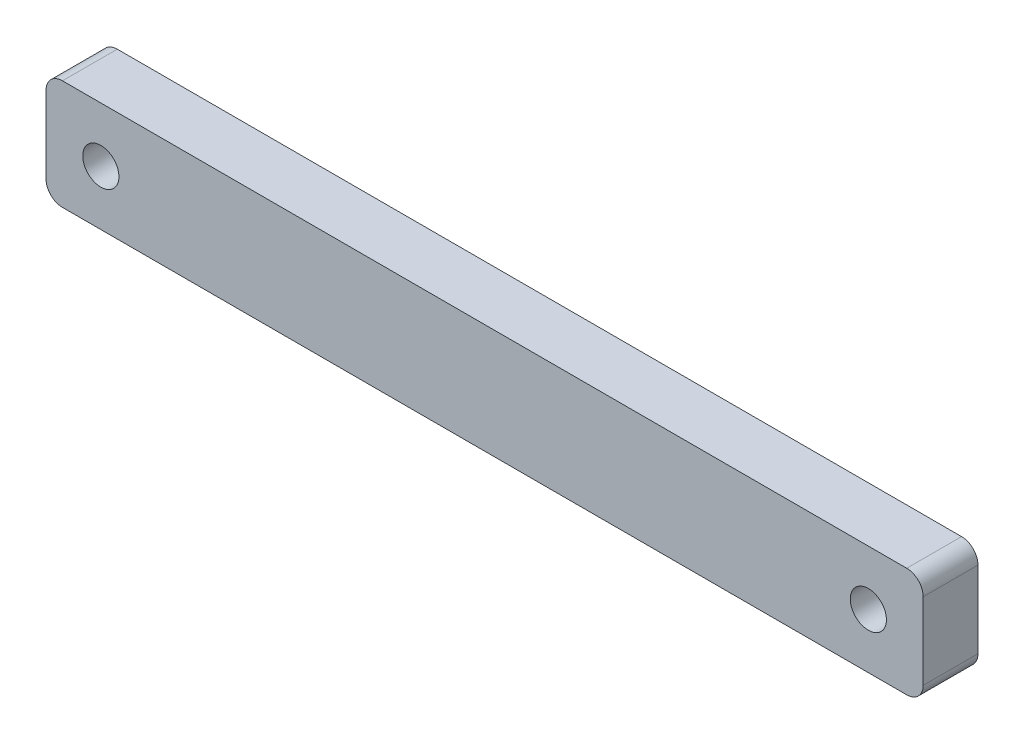
ISO-10303-21;
HEADER;
FILE_DESCRIPTION(('STEP AP214'),'2;1');
FILE_NAME('part.step','',(''),(''),'','','');
FILE_SCHEMA(('AUTOMOTIVE_DESIGN { 1 0 10303 214 1 1 1 1 }'));
ENDSEC;
DATA;
#1=APPLICATION_CONTEXT('core data for automotive mechanical design processes');
#2=APPLICATION_PROTOCOL_DEFINITION('international standard','automotive_design',2000,#1);
#3=PRODUCT_CONTEXT('',#1,'mechanical');
#4=PRODUCT('Part','Part','',(#3));
#5=PRODUCT_RELATED_PRODUCT_CATEGORY('part','',(#4));
#6=PRODUCT_DEFINITION_FORMATION('','',#4);
#7=PRODUCT_DEFINITION_CONTEXT('part definition',#1,'design');
#8=PRODUCT_DEFINITION('design','',#6,#7);
#9=PRODUCT_DEFINITION_SHAPE('','',#8);
#10=(LENGTH_UNIT() NAMED_UNIT(*) SI_UNIT(.MILLI.,.METRE.));
#11=(NAMED_UNIT(*) PLANE_ANGLE_UNIT() SI_UNIT($,.RADIAN.));
#12=(NAMED_UNIT(*) SI_UNIT($,.STERADIAN.) SOLID_ANGLE_UNIT());
#13=UNCERTAINTY_MEASURE_WITH_UNIT(LENGTH_MEASURE(1.E-05),#10,'distance_accuracy_value','');
#14=(GEOMETRIC_REPRESENTATION_CONTEXT(3) GLOBAL_UNCERTAINTY_ASSIGNED_CONTEXT((#13)) GLOBAL_UNIT_ASSIGNED_CONTEXT((#10,
#11,#12)) REPRESENTATION_CONTEXT('',''));
#15=CARTESIAN_POINT('',(0.,0.,0.));
#16=DIRECTION('',(0.,0.,1.));
#17=DIRECTION('',(1.,0.,0.));
#18=AXIS2_PLACEMENT_3D('',#15,#16,#17);
#19=CARTESIAN_POINT('',(-88.9,0.,6.35));
#20=DIRECTION('',(0.,0.,-1.));
#21=DIRECTION('',(-1.,0.,0.));
#22=AXIS2_PLACEMENT_3D('',#19,#20,#21);
#23=CYLINDRICAL_SURFACE('',#22,3.68300000000001);
#24=CARTESIAN_POINT('',(-88.9,0.,6.35));
#25=DIRECTION('',(0.,0.,-1.));
#26=DIRECTION('',(-1.,0.,0.));
#27=AXIS2_PLACEMENT_3D('',#24,#25,#26);
#28=CIRCLE('',#27,3.68300000000001);
#29=CARTESIAN_POINT('',(-92.583,0.,6.35));
#30=VERTEX_POINT('',#29);
#31=EDGE_CURVE('E48',#30,#30,#28,.T.);
#32=ORIENTED_EDGE('',*,*,#31,.T.);
#33=EDGE_LOOP('',(#32));
#34=FACE_BOUND('',#33,.T.);
#35=CARTESIAN_POINT('',(-88.9,0.,0.));
#36=DIRECTION('',(0.,0.,-1.));
#37=DIRECTION('',(-1.,0.,0.));
#38=AXIS2_PLACEMENT_3D('',#35,#36,#37);
#39=CIRCLE('',#38,3.68300000000001);
#40=CARTESIAN_POINT('',(-92.583,0.,0.));
#41=VERTEX_POINT('',#40);
#42=EDGE_CURVE('E11',#41,#41,#39,.T.);
#43=ORIENTED_EDGE('',*,*,#42,.F.);
#44=EDGE_LOOP('',(#43));
#45=FACE_BOUND('',#44,.T.);
#46=ADVANCED_FACE('F44',(#34,#45),#23,.T.);
#47=CARTESIAN_POINT('',(-88.9,0.,6.35));
#48=DIRECTION('',(0.,0.,-1.));
#49=DIRECTION('',(-1.,0.,0.));
#50=AXIS2_PLACEMENT_3D('',#47,#48,#49);
#51=PLANE('',#50);
#52=ORIENTED_EDGE('',*,*,#31,.F.);
#53=EDGE_LOOP('',(#52));
#54=FACE_BOUND('',#53,.T.);
#55=ADVANCED_FACE('F46',(#54),#51,.F.);
#56=CARTESIAN_POINT('',(-88.9,0.,0.));
#57=DIRECTION('',(0.,0.,-1.));
#58=DIRECTION('',(-1.,0.,0.));
#59=AXIS2_PLACEMENT_3D('',#56,#57,#58);
#60=PLANE('',#59);
#61=ORIENTED_EDGE('',*,*,#42,.T.);
#62=EDGE_LOOP('',(#61));
#63=FACE_BOUND('',#62,.T.);
#64=ADVANCED_FACE('F60',(#63),#60,.T.);
#65=CLOSED_SHELL('',(#46,#55,#64));
#66=MANIFOLD_SOLID_BREP('B2',#65);
#67=CARTESIAN_POINT('',(88.9,0.,6.35));
#68=DIRECTION('',(0.,0.,-1.));
#69=DIRECTION('',(-1.,0.,0.));
#70=AXIS2_PLACEMENT_3D('',#67,#68,#69);
#71=CYLINDRICAL_SURFACE('',#70,3.683);
#72=CARTESIAN_POINT('',(88.9,0.,6.35));
#73=DIRECTION('',(0.,0.,-1.));
#74=DIRECTION('',(-1.,0.,0.));
#75=AXIS2_PLACEMENT_3D('',#72,#73,#74);
#76=CIRCLE('',#75,3.683);
#77=CARTESIAN_POINT('',(85.217,0.,6.35));
#78=VERTEX_POINT('',#77);
#79=EDGE_CURVE('E43',#78,#78,#76,.T.);
#80=ORIENTED_EDGE('',*,*,#79,.T.);
#81=EDGE_LOOP('',(#80));
#82=FACE_BOUND('',#81,.T.);
#83=CARTESIAN_POINT('',(88.9,0.,0.));
#84=DIRECTION('',(0.,0.,-1.));
#85=DIRECTION('',(-1.,0.,0.));
#86=AXIS2_PLACEMENT_3D('',#83,#84,#85);
#87=CIRCLE('',#86,3.683);
#88=CARTESIAN_POINT('',(85.217,0.,0.));
#89=VERTEX_POINT('',#88);
#90=EDGE_CURVE('E103',#89,#89,#87,.T.);
#91=ORIENTED_EDGE('',*,*,#90,.F.);
#92=EDGE_LOOP('',(#91));
#93=FACE_BOUND('',#92,.T.);
#94=ADVANCED_FACE('F100',(#82,#93),#71,.T.);
#95=CARTESIAN_POINT('',(88.9,0.,6.35));
#96=DIRECTION('',(0.,0.,-1.));
#97=DIRECTION('',(-1.,0.,0.));
#98=AXIS2_PLACEMENT_3D('',#95,#96,#97);
#99=PLANE('',#98);
#100=ORIENTED_EDGE('',*,*,#79,.F.);
#101=EDGE_LOOP('',(#100));
#102=FACE_BOUND('',#101,.T.);
#103=ADVANCED_FACE('F115',(#102),#99,.F.);
#104=CARTESIAN_POINT('',(88.9,0.,0.));
#105=DIRECTION('',(0.,0.,-1.));
#106=DIRECTION('',(-1.,0.,0.));
#107=AXIS2_PLACEMENT_3D('',#104,#105,#106);
#108=PLANE('',#107);
#109=ORIENTED_EDGE('',*,*,#90,.T.);
#110=EDGE_LOOP('',(#109));
#111=FACE_BOUND('',#110,.T.);
#112=ADVANCED_FACE('F112',(#111),#108,.T.);
#113=CLOSED_SHELL('',(#94,#103,#112));
#114=MANIFOLD_SOLID_BREP('B6',#113);
#115=CARTESIAN_POINT('',(97.79,8.89000000000001,12.7));
#116=DIRECTION('',(0.,0.,1.));
#117=DIRECTION('',(1.,0.,0.));
#118=AXIS2_PLACEMENT_3D('',#115,#116,#117);
#119=PLANE('',#118);
#120=CARTESIAN_POINT('',(-88.9,0.,12.7));
#121=DIRECTION('',(0.,0.,1.));
#122=DIRECTION('',(1.,0.,0.));
#123=AXIS2_PLACEMENT_3D('',#120,#121,#122);
#124=CIRCLE('',#123,4.191);
#125=CARTESIAN_POINT('',(-84.709,0.,12.7));
#126=VERTEX_POINT('',#125);
#127=EDGE_CURVE('E248',#126,#126,#124,.T.);
#128=ORIENTED_EDGE('',*,*,#127,.F.);
#129=EDGE_LOOP('',(#128));
#130=FACE_BOUND('',#129,.T.);
#131=CARTESIAN_POINT('',(97.79,8.89000000000001,12.7));
#132=DIRECTION('',(0.,0.,1.));
#133=DIRECTION('',(1.,0.,0.));
#134=AXIS2_PLACEMENT_3D('',#131,#132,#133);
#135=CIRCLE('',#134,3.81);
#136=CARTESIAN_POINT('',(101.6,8.88999999999999,12.7));
#137=VERTEX_POINT('',#136);
#138=CARTESIAN_POINT('',(97.7899999999999,12.7,12.7));
#139=VERTEX_POINT('',#138);
#140=EDGE_CURVE('E259',#137,#139,#135,.T.);
#141=ORIENTED_EDGE('',*,*,#140,.T.);
#142=DIRECTION('',(-1.,0.,0.));
#143=VECTOR('',#142,1.);
#144=CARTESIAN_POINT('',(97.7899999999999,12.7,12.7));
#145=LINE('',#144,#143);
#146=CARTESIAN_POINT('',(-97.79,12.7,12.7));
#147=VERTEX_POINT('',#146);
#148=EDGE_CURVE('E207',#139,#147,#145,.T.);
#149=ORIENTED_EDGE('',*,*,#148,.T.);
#150=CARTESIAN_POINT('',(-97.79,8.88999999999999,12.7));
#151=DIRECTION('',(0.,0.,1.));
#152=DIRECTION('',(1.,0.,0.));
#153=AXIS2_PLACEMENT_3D('',#150,#151,#152);
#154=CIRCLE('',#153,3.81);
#155=CARTESIAN_POINT('',(-101.6,8.88999999999996,12.7));
#156=VERTEX_POINT('',#155);
#157=EDGE_CURVE('E274',#147,#156,#154,.T.);
#158=ORIENTED_EDGE('',*,*,#157,.T.);
#159=DIRECTION('',(0.,-1.,0.));
#160=VECTOR('',#159,1.);
#161=CARTESIAN_POINT('',(-101.6,-8.88999999999999,12.7));
#162=LINE('',#161,#160);
#163=CARTESIAN_POINT('',(-101.6,-8.89000000000001,12.7));
#164=VERTEX_POINT('',#163);
#165=EDGE_CURVE('E287',#156,#164,#162,.T.);
#166=ORIENTED_EDGE('',*,*,#165,.T.);
#167=CARTESIAN_POINT('',(-97.79,-8.89000000000001,12.7));
#168=DIRECTION('',(0.,0.,1.));
#169=DIRECTION('',(-1.,0.,0.));
#170=AXIS2_PLACEMENT_3D('',#167,#168,#169);
#171=CIRCLE('',#170,3.81);
#172=CARTESIAN_POINT('',(-97.79,-12.7,12.7));
#173=VERTEX_POINT('',#172);
#174=EDGE_CURVE('E226',#164,#173,#171,.T.);
#175=ORIENTED_EDGE('',*,*,#174,.T.);
#176=DIRECTION('',(1.,0.,0.));
#177=VECTOR('',#176,1.);
#178=CARTESIAN_POINT('',(97.7899999999999,-12.7,12.7));
#179=LINE('',#178,#177);
#180=CARTESIAN_POINT('',(97.7899999999999,-12.7,12.7));
#181=VERTEX_POINT('',#180);
#182=EDGE_CURVE('E220',#173,#181,#179,.T.);
#183=ORIENTED_EDGE('',*,*,#182,.T.);
#184=CARTESIAN_POINT('',(97.79,-8.88999999999999,12.7));
#185=DIRECTION('',(0.,0.,1.));
#186=DIRECTION('',(1.,0.,0.));
#187=AXIS2_PLACEMENT_3D('',#184,#185,#186);
#188=CIRCLE('',#187,3.81);
#189=CARTESIAN_POINT('',(101.6,-8.88999999999996,12.7));
#190=VERTEX_POINT('',#189);
#191=EDGE_CURVE('E224',#181,#190,#188,.T.);
#192=ORIENTED_EDGE('',*,*,#191,.T.);
#193=DIRECTION('',(0.,1.,0.));
#194=VECTOR('',#193,1.);
#195=CARTESIAN_POINT('',(101.6,-8.88999999999996,12.7));
#196=LINE('',#195,#194);
#197=EDGE_CURVE('E164',#190,#137,#196,.T.);
#198=ORIENTED_EDGE('',*,*,#197,.T.);
#199=EDGE_LOOP('',(#141,#149,#158,#166,#175,#183,#192,#198));
#200=FACE_BOUND('',#199,.T.);
#201=CARTESIAN_POINT('',(88.9,0.,12.7));
#202=DIRECTION('',(0.,0.,1.));
#203=DIRECTION('',(1.,0.,0.));
#204=AXIS2_PLACEMENT_3D('',#201,#202,#203);
#205=CIRCLE('',#204,4.191);
#206=CARTESIAN_POINT('',(93.091,0.,12.7));
#207=VERTEX_POINT('',#206);
#208=EDGE_CURVE('E296',#207,#207,#205,.T.);
#209=ORIENTED_EDGE('',*,*,#208,.F.);
#210=EDGE_LOOP('',(#209));
#211=FACE_BOUND('',#210,.T.);
#212=ADVANCED_FACE('F147',(#130,#200,#211),#119,.T.);
#213=CARTESIAN_POINT('',(97.79,8.89000000000001,0.));
#214=DIRECTION('',(0.,0.,1.));
#215=DIRECTION('',(1.,0.,0.));
#216=AXIS2_PLACEMENT_3D('',#213,#214,#215);
#217=PLANE('',#216);
#218=CARTESIAN_POINT('',(97.79,8.89000000000001,0.));
#219=DIRECTION('',(0.,0.,1.));
#220=DIRECTION('',(1.,0.,0.));
#221=AXIS2_PLACEMENT_3D('',#218,#219,#220);
#222=CIRCLE('',#221,3.81);
#223=CARTESIAN_POINT('',(101.6,8.88999999999999,0.));
#224=VERTEX_POINT('',#223);
#225=CARTESIAN_POINT('',(97.7899999999999,12.7,0.));
#226=VERTEX_POINT('',#225);
#227=EDGE_CURVE('E244',#224,#226,#222,.T.);
#228=ORIENTED_EDGE('',*,*,#227,.F.);
#229=DIRECTION('',(0.,1.,0.));
#230=VECTOR('',#229,1.);
#231=CARTESIAN_POINT('',(101.6,-8.88999999999996,0.));
#232=LINE('',#231,#230);
#233=CARTESIAN_POINT('',(101.6,-8.88999999999996,0.));
#234=VERTEX_POINT('',#233);
#235=EDGE_CURVE('E199',#234,#224,#232,.T.);
#236=ORIENTED_EDGE('',*,*,#235,.F.);
#237=CARTESIAN_POINT('',(97.79,-8.88999999999999,0.));
#238=DIRECTION('',(0.,0.,1.));
#239=DIRECTION('',(1.,0.,0.));
#240=AXIS2_PLACEMENT_3D('',#237,#238,#239);
#241=CIRCLE('',#240,3.81);
#242=CARTESIAN_POINT('',(97.7899999999999,-12.7,0.));
#243=VERTEX_POINT('',#242);
#244=EDGE_CURVE('E193',#243,#234,#241,.T.);
#245=ORIENTED_EDGE('',*,*,#244,.F.);
#246=DIRECTION('',(1.,0.,0.));
#247=VECTOR('',#246,1.);
#248=CARTESIAN_POINT('',(97.7899999999999,-12.7,0.));
#249=LINE('',#248,#247);
#250=CARTESIAN_POINT('',(-97.79,-12.7,0.));
#251=VERTEX_POINT('',#250);
#252=EDGE_CURVE('E234',#251,#243,#249,.T.);
#253=ORIENTED_EDGE('',*,*,#252,.F.);
#254=CARTESIAN_POINT('',(-97.79,-8.89000000000001,0.));
#255=DIRECTION('',(0.,0.,1.));
#256=DIRECTION('',(-1.,0.,0.));
#257=AXIS2_PLACEMENT_3D('',#254,#255,#256);
#258=CIRCLE('',#257,3.81);
#259=CARTESIAN_POINT('',(-101.6,-8.89000000000001,0.));
#260=VERTEX_POINT('',#259);
#261=EDGE_CURVE('E254',#260,#251,#258,.T.);
#262=ORIENTED_EDGE('',*,*,#261,.F.);
#263=DIRECTION('',(0.,-1.,0.));
#264=VECTOR('',#263,1.);
#265=CARTESIAN_POINT('',(-101.6,-8.88999999999999,0.));
#266=LINE('',#265,#264);
#267=CARTESIAN_POINT('',(-101.6,8.88999999999996,0.));
#268=VERTEX_POINT('',#267);
#269=EDGE_CURVE('E252',#268,#260,#266,.T.);
#270=ORIENTED_EDGE('',*,*,#269,.F.);
#271=CARTESIAN_POINT('',(-97.79,8.88999999999999,0.));
#272=DIRECTION('',(0.,0.,1.));
#273=DIRECTION('',(1.,0.,0.));
#274=AXIS2_PLACEMENT_3D('',#271,#272,#273);
#275=CIRCLE('',#274,3.81);
#276=CARTESIAN_POINT('',(-97.79,12.7,0.));
#277=VERTEX_POINT('',#276);
#278=EDGE_CURVE('E250',#277,#268,#275,.T.);
#279=ORIENTED_EDGE('',*,*,#278,.F.);
#280=DIRECTION('',(-1.,0.,0.));
#281=VECTOR('',#280,1.);
#282=CARTESIAN_POINT('',(97.7899999999999,12.7,0.));
#283=LINE('',#282,#281);
#284=EDGE_CURVE('E247',#226,#277,#283,.T.);
#285=ORIENTED_EDGE('',*,*,#284,.F.);
#286=EDGE_LOOP('',(#228,#236,#245,#253,#262,#270,#279,#285));
#287=FACE_BOUND('',#286,.T.);
#288=CARTESIAN_POINT('',(-88.9,0.,0.));
#289=DIRECTION('',(0.,0.,1.));
#290=DIRECTION('',(1.,0.,0.));
#291=AXIS2_PLACEMENT_3D('',#288,#289,#290);
#292=CIRCLE('',#291,4.191);
#293=CARTESIAN_POINT('',(-84.709,0.,0.));
#294=VERTEX_POINT('',#293);
#295=EDGE_CURVE('E293',#294,#294,#292,.T.);
#296=ORIENTED_EDGE('',*,*,#295,.T.);
#297=EDGE_LOOP('',(#296));
#298=FACE_BOUND('',#297,.T.);
#299=CARTESIAN_POINT('',(88.9,0.,0.));
#300=DIRECTION('',(0.,0.,1.));
#301=DIRECTION('',(1.,0.,0.));
#302=AXIS2_PLACEMENT_3D('',#299,#300,#301);
#303=CIRCLE('',#302,4.191);
#304=CARTESIAN_POINT('',(93.091,0.,0.));
#305=VERTEX_POINT('',#304);
#306=EDGE_CURVE('E299',#305,#305,#303,.T.);
#307=ORIENTED_EDGE('',*,*,#306,.T.);
#308=EDGE_LOOP('',(#307));
#309=FACE_BOUND('',#308,.T.);
#310=ADVANCED_FACE('F278',(#287,#298,#309),#217,.F.);
#311=CARTESIAN_POINT('',(97.79,8.89000000000001,12.7));
#312=DIRECTION('',(0.,0.,-1.));
#313=DIRECTION('',(-1.,0.,0.));
#314=AXIS2_PLACEMENT_3D('',#311,#312,#313);
#315=CYLINDRICAL_SURFACE('',#314,3.81);
#316=ORIENTED_EDGE('',*,*,#227,.T.);
#317=DIRECTION('',(0.,0.,-1.));
#318=VECTOR('',#317,1.);
#319=CARTESIAN_POINT('',(97.7899999999999,12.7,12.7));
#320=LINE('',#319,#318);
#321=EDGE_CURVE('E98',#139,#226,#320,.T.);
#322=ORIENTED_EDGE('',*,*,#321,.F.);
#323=ORIENTED_EDGE('',*,*,#140,.F.);
#324=DIRECTION('',(0.,0.,-1.));
#325=VECTOR('',#324,1.);
#326=CARTESIAN_POINT('',(101.6,8.88999999999999,12.7));
#327=LINE('',#326,#325);
#328=EDGE_CURVE('E240',#137,#224,#327,.T.);
#329=ORIENTED_EDGE('',*,*,#328,.T.);
#330=EDGE_LOOP('',(#316,#322,#323,#329));
#331=FACE_BOUND('',#330,.T.);
#332=ADVANCED_FACE('F149',(#331),#315,.T.);
#333=CARTESIAN_POINT('',(97.7899999999999,12.7,12.7));
#334=DIRECTION('',(0.,-1.,0.));
#335=DIRECTION('',(1.,0.,0.));
#336=AXIS2_PLACEMENT_3D('',#333,#334,#335);
#337=PLANE('',#336);
#338=ORIENTED_EDGE('',*,*,#284,.T.);
#339=DIRECTION('',(0.,0.,-1.));
#340=VECTOR('',#339,1.);
#341=CARTESIAN_POINT('',(-97.79,12.7,12.7));
#342=LINE('',#341,#340);
#343=EDGE_CURVE('E156',#147,#277,#342,.T.);
#344=ORIENTED_EDGE('',*,*,#343,.F.);
#345=ORIENTED_EDGE('',*,*,#148,.F.);
#346=ORIENTED_EDGE('',*,*,#321,.T.);
#347=EDGE_LOOP('',(#338,#344,#345,#346));
#348=FACE_BOUND('',#347,.T.);
#349=ADVANCED_FACE('F331',(#348),#337,.F.);
#350=CARTESIAN_POINT('',(-97.79,8.88999999999999,12.7));
#351=DIRECTION('',(0.,0.,-1.));
#352=DIRECTION('',(-1.,0.,0.));
#353=AXIS2_PLACEMENT_3D('',#350,#351,#352);
#354=CYLINDRICAL_SURFACE('',#353,3.81);
#355=ORIENTED_EDGE('',*,*,#278,.T.);
#356=DIRECTION('',(0.,0.,-1.));
#357=VECTOR('',#356,1.);
#358=CARTESIAN_POINT('',(-101.6,8.88999999999996,12.7));
#359=LINE('',#358,#357);
#360=EDGE_CURVE('E266',#156,#268,#359,.T.);
#361=ORIENTED_EDGE('',*,*,#360,.F.);
#362=ORIENTED_EDGE('',*,*,#157,.F.);
#363=ORIENTED_EDGE('',*,*,#343,.T.);
#364=EDGE_LOOP('',(#355,#361,#362,#363));
#365=FACE_BOUND('',#364,.T.);
#366=ADVANCED_FACE('F272',(#365),#354,.T.);
#367=CARTESIAN_POINT('',(-101.6,-8.88999999999999,12.7));
#368=DIRECTION('',(1.,0.,0.));
#369=DIRECTION('',(0.,0.,-1.));
#370=AXIS2_PLACEMENT_3D('',#367,#368,#369);
#371=PLANE('',#370);
#372=ORIENTED_EDGE('',*,*,#269,.T.);
#373=DIRECTION('',(0.,0.,-1.));
#374=VECTOR('',#373,1.);
#375=CARTESIAN_POINT('',(-101.6,-8.89000000000001,12.7));
#376=LINE('',#375,#374);
#377=EDGE_CURVE('E263',#164,#260,#376,.T.);
#378=ORIENTED_EDGE('',*,*,#377,.F.);
#379=ORIENTED_EDGE('',*,*,#165,.F.);
#380=ORIENTED_EDGE('',*,*,#360,.T.);
#381=EDGE_LOOP('',(#372,#378,#379,#380));
#382=FACE_BOUND('',#381,.T.);
#383=ADVANCED_FACE('F283',(#382),#371,.F.);
#384=CARTESIAN_POINT('',(-97.79,-8.89000000000001,12.7));
#385=DIRECTION('',(0.,0.,-1.));
#386=DIRECTION('',(-1.,0.,0.));
#387=AXIS2_PLACEMENT_3D('',#384,#385,#386);
#388=CYLINDRICAL_SURFACE('',#387,3.81);
#389=ORIENTED_EDGE('',*,*,#261,.T.);
#390=DIRECTION('',(0.,0.,-1.));
#391=VECTOR('',#390,1.);
#392=CARTESIAN_POINT('',(-97.79,-12.7,12.7));
#393=LINE('',#392,#391);
#394=EDGE_CURVE('E235',#173,#251,#393,.T.);
#395=ORIENTED_EDGE('',*,*,#394,.F.);
#396=ORIENTED_EDGE('',*,*,#174,.F.);
#397=ORIENTED_EDGE('',*,*,#377,.T.);
#398=EDGE_LOOP('',(#389,#395,#396,#397));
#399=FACE_BOUND('',#398,.T.);
#400=ADVANCED_FACE('F286',(#399),#388,.T.);
#401=CARTESIAN_POINT('',(97.7899999999999,-12.7,12.7));
#402=DIRECTION('',(0.,1.,0.));
#403=DIRECTION('',(-1.,0.,0.));
#404=AXIS2_PLACEMENT_3D('',#401,#402,#403);
#405=PLANE('',#404);
#406=ORIENTED_EDGE('',*,*,#252,.T.);
#407=DIRECTION('',(0.,0.,-1.));
#408=VECTOR('',#407,1.);
#409=CARTESIAN_POINT('',(97.7899999999999,-12.7,12.7));
#410=LINE('',#409,#408);
#411=EDGE_CURVE('E231',#181,#243,#410,.T.);
#412=ORIENTED_EDGE('',*,*,#411,.F.);
#413=ORIENTED_EDGE('',*,*,#182,.F.);
#414=ORIENTED_EDGE('',*,*,#394,.T.);
#415=EDGE_LOOP('',(#406,#412,#413,#414));
#416=FACE_BOUND('',#415,.T.);
#417=ADVANCED_FACE('F232',(#416),#405,.F.);
#418=CARTESIAN_POINT('',(97.79,-8.88999999999999,12.7));
#419=DIRECTION('',(0.,0.,-1.));
#420=DIRECTION('',(-1.,0.,0.));
#421=AXIS2_PLACEMENT_3D('',#418,#419,#420);
#422=CYLINDRICAL_SURFACE('',#421,3.81);
#423=ORIENTED_EDGE('',*,*,#244,.T.);
#424=DIRECTION('',(0.,0.,-1.));
#425=VECTOR('',#424,1.);
#426=CARTESIAN_POINT('',(101.6,-8.88999999999996,12.7));
#427=LINE('',#426,#425);
#428=EDGE_CURVE('E236',#190,#234,#427,.T.);
#429=ORIENTED_EDGE('',*,*,#428,.F.);
#430=ORIENTED_EDGE('',*,*,#191,.F.);
#431=ORIENTED_EDGE('',*,*,#411,.T.);
#432=EDGE_LOOP('',(#423,#429,#430,#431));
#433=FACE_BOUND('',#432,.T.);
#434=ADVANCED_FACE('F238',(#433),#422,.T.);
#435=CARTESIAN_POINT('',(101.6,-8.88999999999996,12.7));
#436=DIRECTION('',(-1.,0.,0.));
#437=DIRECTION('',(0.,0.,1.));
#438=AXIS2_PLACEMENT_3D('',#435,#436,#437);
#439=PLANE('',#438);
#440=ORIENTED_EDGE('',*,*,#235,.T.);
#441=ORIENTED_EDGE('',*,*,#328,.F.);
#442=ORIENTED_EDGE('',*,*,#197,.F.);
#443=ORIENTED_EDGE('',*,*,#428,.T.);
#444=EDGE_LOOP('',(#440,#441,#442,#443));
#445=FACE_BOUND('',#444,.T.);
#446=ADVANCED_FACE('F319',(#445),#439,.F.);
#447=CARTESIAN_POINT('',(-88.9,0.,12.7));
#448=DIRECTION('',(0.,0.,-1.));
#449=DIRECTION('',(-1.,0.,0.));
#450=AXIS2_PLACEMENT_3D('',#447,#448,#449);
#451=CYLINDRICAL_SURFACE('',#450,4.191);
#452=ORIENTED_EDGE('',*,*,#127,.T.);
#453=EDGE_LOOP('',(#452));
#454=FACE_BOUND('',#453,.T.);
#455=ORIENTED_EDGE('',*,*,#295,.F.);
#456=EDGE_LOOP('',(#455));
#457=FACE_BOUND('',#456,.T.);
#458=ADVANCED_FACE('F316',(#454,#457),#451,.F.);
#459=CARTESIAN_POINT('',(88.9,0.,12.7));
#460=DIRECTION('',(0.,0.,-1.));
#461=DIRECTION('',(-1.,0.,0.));
#462=AXIS2_PLACEMENT_3D('',#459,#460,#461);
#463=CYLINDRICAL_SURFACE('',#462,4.191);
#464=ORIENTED_EDGE('',*,*,#208,.T.);
#465=EDGE_LOOP('',(#464));
#466=FACE_BOUND('',#465,.T.);
#467=ORIENTED_EDGE('',*,*,#306,.F.);
#468=EDGE_LOOP('',(#467));
#469=FACE_BOUND('',#468,.T.);
#470=ADVANCED_FACE('F305',(#466,#469),#463,.F.);
#471=CLOSED_SHELL('',(#212,#310,#332,#349,#366,#383,#400,#417,#434,#446,#458,#470));
#472=MANIFOLD_SOLID_BREP('B38',#471);
#473=ADVANCED_BREP_SHAPE_REPRESENTATION('',(#18,#66,#114,#472),#14);
#474=SHAPE_DEFINITION_REPRESENTATION(#9,#473);
ENDSEC;
END-ISO-10303-21;
